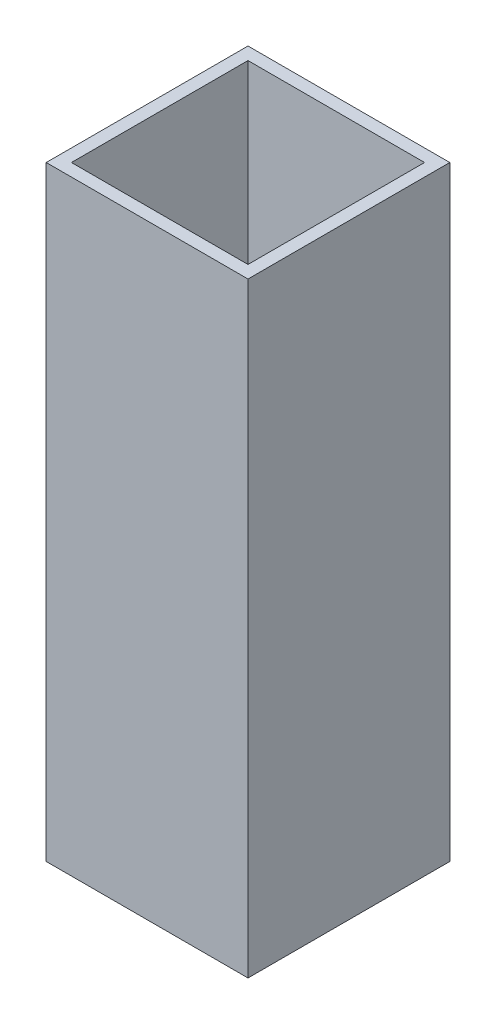
ISO-10303-21;
HEADER;
FILE_DESCRIPTION(('STEP AP214'),'2;1');
FILE_NAME('part.step','',(''),(''),'','','');
FILE_SCHEMA(('AUTOMOTIVE_DESIGN { 1 0 10303 214 1 1 1 1 }'));
ENDSEC;
DATA;
#1=APPLICATION_CONTEXT('core data for automotive mechanical design processes');
#2=APPLICATION_PROTOCOL_DEFINITION('international standard','automotive_design',2000,#1);
#3=PRODUCT_CONTEXT('',#1,'mechanical');
#4=PRODUCT('Part','Part','',(#3));
#5=PRODUCT_RELATED_PRODUCT_CATEGORY('part','',(#4));
#6=PRODUCT_DEFINITION_FORMATION('','',#4);
#7=PRODUCT_DEFINITION_CONTEXT('part definition',#1,'design');
#8=PRODUCT_DEFINITION('design','',#6,#7);
#9=PRODUCT_DEFINITION_SHAPE('','',#8);
#10=(LENGTH_UNIT() NAMED_UNIT(*) SI_UNIT(.MILLI.,.METRE.));
#11=(NAMED_UNIT(*) PLANE_ANGLE_UNIT() SI_UNIT($,.RADIAN.));
#12=(NAMED_UNIT(*) SI_UNIT($,.STERADIAN.) SOLID_ANGLE_UNIT());
#13=UNCERTAINTY_MEASURE_WITH_UNIT(LENGTH_MEASURE(1.E-05),#10,'distance_accuracy_value','');
#14=(GEOMETRIC_REPRESENTATION_CONTEXT(3) GLOBAL_UNCERTAINTY_ASSIGNED_CONTEXT((#13)) GLOBAL_UNIT_ASSIGNED_CONTEXT((#10,
#11,#12)) REPRESENTATION_CONTEXT('',''));
#15=CARTESIAN_POINT('',(0.,0.,0.));
#16=DIRECTION('',(0.,0.,1.));
#17=DIRECTION('',(1.,0.,0.));
#18=AXIS2_PLACEMENT_3D('',#15,#16,#17);
#19=CARTESIAN_POINT('',(0.,76.2,0.));
#20=DIRECTION('',(0.,1.,0.));
#21=DIRECTION('',(0.,0.,1.));
#22=AXIS2_PLACEMENT_3D('',#19,#20,#21);
#23=PLANE('',#22);
#24=DIRECTION('',(0.,0.,1.));
#25=VECTOR('',#24,1.);
#26=CARTESIAN_POINT('',(-12.7,76.2,12.7));
#27=LINE('',#26,#25);
#28=CARTESIAN_POINT('',(-12.7,76.2,-12.7));
#29=VERTEX_POINT('',#28);
#30=CARTESIAN_POINT('',(-12.7,76.2,12.7));
#31=VERTEX_POINT('',#30);
#32=EDGE_CURVE('E134',#29,#31,#27,.T.);
#33=ORIENTED_EDGE('',*,*,#32,.T.);
#34=DIRECTION('',(1.,0.,0.));
#35=VECTOR('',#34,1.);
#36=CARTESIAN_POINT('',(12.7,76.2,12.7));
#37=LINE('',#36,#35);
#38=CARTESIAN_POINT('',(12.7,76.2,12.7));
#39=VERTEX_POINT('',#38);
#40=EDGE_CURVE('E137',#31,#39,#37,.T.);
#41=ORIENTED_EDGE('',*,*,#40,.T.);
#42=DIRECTION('',(0.,0.,-1.));
#43=VECTOR('',#42,1.);
#44=CARTESIAN_POINT('',(12.7,76.2,12.7));
#45=LINE('',#44,#43);
#46=CARTESIAN_POINT('',(12.7,76.2,-12.7));
#47=VERTEX_POINT('',#46);
#48=EDGE_CURVE('E140',#39,#47,#45,.T.);
#49=ORIENTED_EDGE('',*,*,#48,.T.);
#50=DIRECTION('',(-1.,0.,0.));
#51=VECTOR('',#50,1.);
#52=CARTESIAN_POINT('',(12.7,76.2,-12.7));
#53=LINE('',#52,#51);
#54=EDGE_CURVE('E142',#47,#29,#53,.T.);
#55=ORIENTED_EDGE('',*,*,#54,.T.);
#56=EDGE_LOOP('',(#33,#41,#49,#55));
#57=FACE_BOUND('',#56,.T.);
#58=DIRECTION('',(1.,0.,0.));
#59=VECTOR('',#58,1.);
#60=CARTESIAN_POINT('',(11.1125,76.2,11.1125));
#61=LINE('',#60,#59);
#62=CARTESIAN_POINT('',(-11.1125,76.2,11.1125));
#63=VERTEX_POINT('',#62);
#64=CARTESIAN_POINT('',(11.1125,76.2,11.1125));
#65=VERTEX_POINT('',#64);
#66=EDGE_CURVE('E106',#63,#65,#61,.T.);
#67=ORIENTED_EDGE('',*,*,#66,.F.);
#68=DIRECTION('',(0.,0.,1.));
#69=VECTOR('',#68,1.);
#70=CARTESIAN_POINT('',(-11.1125,76.2,11.1125));
#71=LINE('',#70,#69);
#72=CARTESIAN_POINT('',(-11.1125,76.2,-11.1125));
#73=VERTEX_POINT('',#72);
#74=EDGE_CURVE('E98',#73,#63,#71,.T.);
#75=ORIENTED_EDGE('',*,*,#74,.F.);
#76=DIRECTION('',(-1.,0.,0.));
#77=VECTOR('',#76,1.);
#78=CARTESIAN_POINT('',(11.1125,76.2,-11.1125));
#79=LINE('',#78,#77);
#80=CARTESIAN_POINT('',(11.1125,76.2,-11.1125));
#81=VERTEX_POINT('',#80);
#82=EDGE_CURVE('E120',#81,#73,#79,.T.);
#83=ORIENTED_EDGE('',*,*,#82,.F.);
#84=DIRECTION('',(0.,0.,-1.));
#85=VECTOR('',#84,1.);
#86=CARTESIAN_POINT('',(11.1125,76.2,11.1125));
#87=LINE('',#86,#85);
#88=EDGE_CURVE('E118',#65,#81,#87,.T.);
#89=ORIENTED_EDGE('',*,*,#88,.F.);
#90=EDGE_LOOP('',(#67,#75,#83,#89));
#91=FACE_BOUND('',#90,.T.);
#92=ADVANCED_FACE('F33',(#57,#91),#23,.T.);
#93=CARTESIAN_POINT('',(0.,0.,0.));
#94=DIRECTION('',(0.,1.,0.));
#95=DIRECTION('',(0.,0.,1.));
#96=AXIS2_PLACEMENT_3D('',#93,#94,#95);
#97=PLANE('',#96);
#98=DIRECTION('',(0.,0.,1.));
#99=VECTOR('',#98,1.);
#100=CARTESIAN_POINT('',(-12.7,0.,12.7));
#101=LINE('',#100,#99);
#102=CARTESIAN_POINT('',(-12.7,0.,-12.7));
#103=VERTEX_POINT('',#102);
#104=CARTESIAN_POINT('',(-12.7,0.,12.7));
#105=VERTEX_POINT('',#104);
#106=EDGE_CURVE('E114',#103,#105,#101,.T.);
#107=ORIENTED_EDGE('',*,*,#106,.F.);
#108=DIRECTION('',(-1.,0.,0.));
#109=VECTOR('',#108,1.);
#110=CARTESIAN_POINT('',(12.7,0.,-12.7));
#111=LINE('',#110,#109);
#112=CARTESIAN_POINT('',(12.7,0.,-12.7));
#113=VERTEX_POINT('',#112);
#114=EDGE_CURVE('E138',#113,#103,#111,.T.);
#115=ORIENTED_EDGE('',*,*,#114,.F.);
#116=DIRECTION('',(0.,0.,-1.));
#117=VECTOR('',#116,1.);
#118=CARTESIAN_POINT('',(12.7,0.,12.7));
#119=LINE('',#118,#117);
#120=CARTESIAN_POINT('',(12.7,0.,12.7));
#121=VERTEX_POINT('',#120);
#122=EDGE_CURVE('E149',#121,#113,#119,.T.);
#123=ORIENTED_EDGE('',*,*,#122,.F.);
#124=DIRECTION('',(1.,0.,0.));
#125=VECTOR('',#124,1.);
#126=CARTESIAN_POINT('',(12.7,0.,12.7));
#127=LINE('',#126,#125);
#128=EDGE_CURVE('E147',#105,#121,#127,.T.);
#129=ORIENTED_EDGE('',*,*,#128,.F.);
#130=EDGE_LOOP('',(#107,#115,#123,#129));
#131=FACE_BOUND('',#130,.T.);
#132=DIRECTION('',(0.,0.,1.));
#133=VECTOR('',#132,1.);
#134=CARTESIAN_POINT('',(-11.1125,0.,11.1125));
#135=LINE('',#134,#133);
#136=CARTESIAN_POINT('',(-11.1125,0.,-11.1125));
#137=VERTEX_POINT('',#136);
#138=CARTESIAN_POINT('',(-11.1125,0.,11.1125));
#139=VERTEX_POINT('',#138);
#140=EDGE_CURVE('E56',#137,#139,#135,.T.);
#141=ORIENTED_EDGE('',*,*,#140,.T.);
#142=DIRECTION('',(1.,0.,0.));
#143=VECTOR('',#142,1.);
#144=CARTESIAN_POINT('',(11.1125,0.,11.1125));
#145=LINE('',#144,#143);
#146=CARTESIAN_POINT('',(11.1125,0.,11.1125));
#147=VERTEX_POINT('',#146);
#148=EDGE_CURVE('E113',#139,#147,#145,.T.);
#149=ORIENTED_EDGE('',*,*,#148,.T.);
#150=DIRECTION('',(0.,0.,-1.));
#151=VECTOR('',#150,1.);
#152=CARTESIAN_POINT('',(11.1125,0.,11.1125));
#153=LINE('',#152,#151);
#154=CARTESIAN_POINT('',(11.1125,0.,-11.1125));
#155=VERTEX_POINT('',#154);
#156=EDGE_CURVE('E126',#147,#155,#153,.T.);
#157=ORIENTED_EDGE('',*,*,#156,.T.);
#158=DIRECTION('',(-1.,0.,0.));
#159=VECTOR('',#158,1.);
#160=CARTESIAN_POINT('',(11.1125,0.,-11.1125));
#161=LINE('',#160,#159);
#162=EDGE_CURVE('E107',#155,#137,#161,.T.);
#163=ORIENTED_EDGE('',*,*,#162,.T.);
#164=EDGE_LOOP('',(#141,#149,#157,#163));
#165=FACE_BOUND('',#164,.T.);
#166=ADVANCED_FACE('F167',(#131,#165),#97,.F.);
#167=CARTESIAN_POINT('',(-12.7,76.2,12.7));
#168=DIRECTION('',(1.,0.,0.));
#169=DIRECTION('',(0.,0.,-1.));
#170=AXIS2_PLACEMENT_3D('',#167,#168,#169);
#171=PLANE('',#170);
#172=ORIENTED_EDGE('',*,*,#106,.T.);
#173=DIRECTION('',(0.,-1.,0.));
#174=VECTOR('',#173,1.);
#175=CARTESIAN_POINT('',(-12.7,76.2,12.7));
#176=LINE('',#175,#174);
#177=EDGE_CURVE('E11',#31,#105,#176,.T.);
#178=ORIENTED_EDGE('',*,*,#177,.F.);
#179=ORIENTED_EDGE('',*,*,#32,.F.);
#180=DIRECTION('',(0.,-1.,0.));
#181=VECTOR('',#180,1.);
#182=CARTESIAN_POINT('',(-12.7,76.2,-12.7));
#183=LINE('',#182,#181);
#184=EDGE_CURVE('E144',#29,#103,#183,.T.);
#185=ORIENTED_EDGE('',*,*,#184,.T.);
#186=EDGE_LOOP('',(#172,#178,#179,#185));
#187=FACE_BOUND('',#186,.T.);
#188=ADVANCED_FACE('F35',(#187),#171,.F.);
#189=CARTESIAN_POINT('',(12.7,76.2,12.7));
#190=DIRECTION('',(0.,0.,-1.));
#191=DIRECTION('',(-1.,0.,0.));
#192=AXIS2_PLACEMENT_3D('',#189,#190,#191);
#193=PLANE('',#192);
#194=ORIENTED_EDGE('',*,*,#128,.T.);
#195=DIRECTION('',(0.,-1.,0.));
#196=VECTOR('',#195,1.);
#197=CARTESIAN_POINT('',(12.7,76.2,12.7));
#198=LINE('',#197,#196);
#199=EDGE_CURVE('E41',#39,#121,#198,.T.);
#200=ORIENTED_EDGE('',*,*,#199,.F.);
#201=ORIENTED_EDGE('',*,*,#40,.F.);
#202=ORIENTED_EDGE('',*,*,#177,.T.);
#203=EDGE_LOOP('',(#194,#200,#201,#202));
#204=FACE_BOUND('',#203,.T.);
#205=ADVANCED_FACE('F177',(#204),#193,.F.);
#206=CARTESIAN_POINT('',(12.7,76.2,12.7));
#207=DIRECTION('',(-1.,0.,0.));
#208=DIRECTION('',(0.,0.,1.));
#209=AXIS2_PLACEMENT_3D('',#206,#207,#208);
#210=PLANE('',#209);
#211=ORIENTED_EDGE('',*,*,#122,.T.);
#212=DIRECTION('',(0.,-1.,0.));
#213=VECTOR('',#212,1.);
#214=CARTESIAN_POINT('',(12.7,76.2,-12.7));
#215=LINE('',#214,#213);
#216=EDGE_CURVE('E154',#47,#113,#215,.T.);
#217=ORIENTED_EDGE('',*,*,#216,.F.);
#218=ORIENTED_EDGE('',*,*,#48,.F.);
#219=ORIENTED_EDGE('',*,*,#199,.T.);
#220=EDGE_LOOP('',(#211,#217,#218,#219));
#221=FACE_BOUND('',#220,.T.);
#222=ADVANCED_FACE('F161',(#221),#210,.F.);
#223=CARTESIAN_POINT('',(12.7,76.2,-12.7));
#224=DIRECTION('',(0.,0.,1.));
#225=DIRECTION('',(1.,0.,0.));
#226=AXIS2_PLACEMENT_3D('',#223,#224,#225);
#227=PLANE('',#226);
#228=ORIENTED_EDGE('',*,*,#114,.T.);
#229=ORIENTED_EDGE('',*,*,#184,.F.);
#230=ORIENTED_EDGE('',*,*,#54,.F.);
#231=ORIENTED_EDGE('',*,*,#216,.T.);
#232=EDGE_LOOP('',(#228,#229,#230,#231));
#233=FACE_BOUND('',#232,.T.);
#234=ADVANCED_FACE('F171',(#233),#227,.F.);
#235=CARTESIAN_POINT('',(-11.1125,76.2,11.1125));
#236=DIRECTION('',(1.,0.,0.));
#237=DIRECTION('',(0.,0.,-1.));
#238=AXIS2_PLACEMENT_3D('',#235,#236,#237);
#239=PLANE('',#238);
#240=ORIENTED_EDGE('',*,*,#140,.F.);
#241=DIRECTION('',(0.,-1.,0.));
#242=VECTOR('',#241,1.);
#243=CARTESIAN_POINT('',(-11.1125,76.2,-11.1125));
#244=LINE('',#243,#242);
#245=EDGE_CURVE('E102',#73,#137,#244,.T.);
#246=ORIENTED_EDGE('',*,*,#245,.F.);
#247=ORIENTED_EDGE('',*,*,#74,.T.);
#248=DIRECTION('',(0.,-1.,0.));
#249=VECTOR('',#248,1.);
#250=CARTESIAN_POINT('',(-11.1125,76.2,11.1125));
#251=LINE('',#250,#249);
#252=EDGE_CURVE('E101',#63,#139,#251,.T.);
#253=ORIENTED_EDGE('',*,*,#252,.T.);
#254=EDGE_LOOP('',(#240,#246,#247,#253));
#255=FACE_BOUND('',#254,.T.);
#256=ADVANCED_FACE('F100',(#255),#239,.T.);
#257=CARTESIAN_POINT('',(11.1125,76.2,11.1125));
#258=DIRECTION('',(0.,0.,-1.));
#259=DIRECTION('',(-1.,0.,0.));
#260=AXIS2_PLACEMENT_3D('',#257,#258,#259);
#261=PLANE('',#260);
#262=ORIENTED_EDGE('',*,*,#148,.F.);
#263=ORIENTED_EDGE('',*,*,#252,.F.);
#264=ORIENTED_EDGE('',*,*,#66,.T.);
#265=DIRECTION('',(0.,-1.,0.));
#266=VECTOR('',#265,1.);
#267=CARTESIAN_POINT('',(11.1125,76.2,11.1125));
#268=LINE('',#267,#266);
#269=EDGE_CURVE('E115',#65,#147,#268,.T.);
#270=ORIENTED_EDGE('',*,*,#269,.T.);
#271=EDGE_LOOP('',(#262,#263,#264,#270));
#272=FACE_BOUND('',#271,.T.);
#273=ADVANCED_FACE('F110',(#272),#261,.T.);
#274=CARTESIAN_POINT('',(11.1125,76.2,11.1125));
#275=DIRECTION('',(-1.,0.,0.));
#276=DIRECTION('',(0.,0.,1.));
#277=AXIS2_PLACEMENT_3D('',#274,#275,#276);
#278=PLANE('',#277);
#279=ORIENTED_EDGE('',*,*,#156,.F.);
#280=ORIENTED_EDGE('',*,*,#269,.F.);
#281=ORIENTED_EDGE('',*,*,#88,.T.);
#282=DIRECTION('',(0.,-1.,0.));
#283=VECTOR('',#282,1.);
#284=CARTESIAN_POINT('',(11.1125,76.2,-11.1125));
#285=LINE('',#284,#283);
#286=EDGE_CURVE('E48',#81,#155,#285,.T.);
#287=ORIENTED_EDGE('',*,*,#286,.T.);
#288=EDGE_LOOP('',(#279,#280,#281,#287));
#289=FACE_BOUND('',#288,.T.);
#290=ADVANCED_FACE('F200',(#289),#278,.T.);
#291=CARTESIAN_POINT('',(11.1125,76.2,-11.1125));
#292=DIRECTION('',(0.,0.,1.));
#293=DIRECTION('',(1.,0.,0.));
#294=AXIS2_PLACEMENT_3D('',#291,#292,#293);
#295=PLANE('',#294);
#296=ORIENTED_EDGE('',*,*,#162,.F.);
#297=ORIENTED_EDGE('',*,*,#286,.F.);
#298=ORIENTED_EDGE('',*,*,#82,.T.);
#299=ORIENTED_EDGE('',*,*,#245,.T.);
#300=EDGE_LOOP('',(#296,#297,#298,#299));
#301=FACE_BOUND('',#300,.T.);
#302=ADVANCED_FACE('F204',(#301),#295,.T.);
#303=CLOSED_SHELL('',(#92,#166,#188,#205,#222,#234,#256,#273,#290,#302));
#304=MANIFOLD_SOLID_BREP('B2',#303);
#305=ADVANCED_BREP_SHAPE_REPRESENTATION('',(#18,#304),#14);
#306=SHAPE_DEFINITION_REPRESENTATION(#9,#305);
ENDSEC;
END-ISO-10303-21;
